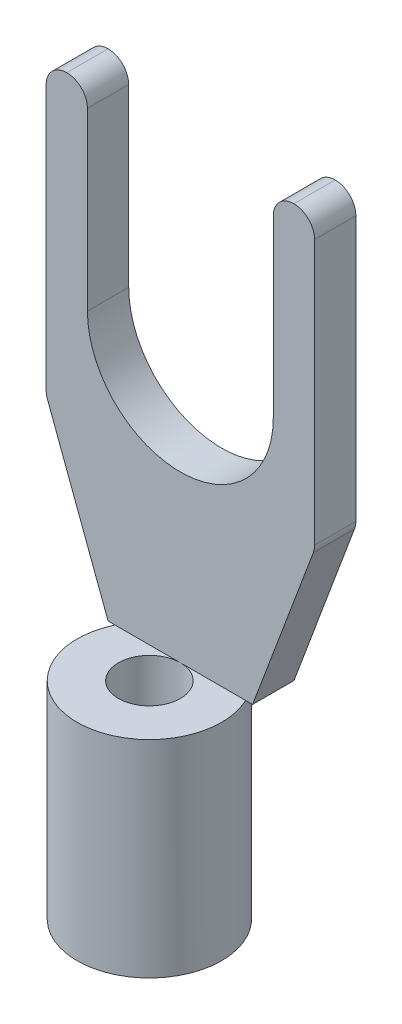
ISO-10303-21;
HEADER;
FILE_DESCRIPTION(('STEP AP214'),'2;1');
FILE_NAME('part.step','',(''),(''),'','','');
FILE_SCHEMA(('AUTOMOTIVE_DESIGN { 1 0 10303 214 1 1 1 1 }'));
ENDSEC;
DATA;
#1=APPLICATION_CONTEXT('core data for automotive mechanical design processes');
#2=APPLICATION_PROTOCOL_DEFINITION('international standard','automotive_design',2000,#1);
#3=PRODUCT_CONTEXT('',#1,'mechanical');
#4=PRODUCT('Part','Part','',(#3));
#5=PRODUCT_RELATED_PRODUCT_CATEGORY('part','',(#4));
#6=PRODUCT_DEFINITION_FORMATION('','',#4);
#7=PRODUCT_DEFINITION_CONTEXT('part definition',#1,'design');
#8=PRODUCT_DEFINITION('design','',#6,#7);
#9=PRODUCT_DEFINITION_SHAPE('','',#8);
#10=(LENGTH_UNIT() NAMED_UNIT(*) SI_UNIT(.MILLI.,.METRE.));
#11=(NAMED_UNIT(*) PLANE_ANGLE_UNIT() SI_UNIT($,.RADIAN.));
#12=(NAMED_UNIT(*) SI_UNIT($,.STERADIAN.) SOLID_ANGLE_UNIT());
#13=UNCERTAINTY_MEASURE_WITH_UNIT(LENGTH_MEASURE(1.E-05),#10,'distance_accuracy_value','');
#14=(GEOMETRIC_REPRESENTATION_CONTEXT(3) GLOBAL_UNCERTAINTY_ASSIGNED_CONTEXT((#13)) GLOBAL_UNIT_ASSIGNED_CONTEXT((#10,
#11,#12)) REPRESENTATION_CONTEXT('',''));
#15=CARTESIAN_POINT('',(0.,0.,0.));
#16=DIRECTION('',(0.,0.,1.));
#17=DIRECTION('',(1.,0.,0.));
#18=AXIS2_PLACEMENT_3D('',#15,#16,#17);
#19=CARTESIAN_POINT('',(-1.75,-2.,1.));
#20=DIRECTION('',(0.,1.,0.));
#21=DIRECTION('',(-1.,0.,0.));
#22=AXIS2_PLACEMENT_3D('',#19,#20,#21);
#23=PLANE('',#22);
#24=CARTESIAN_POINT('',(0.,-2.,1.75));
#25=DIRECTION('',(0.,-1.,0.));
#26=DIRECTION('',(1.,0.,0.));
#27=AXIS2_PLACEMENT_3D('',#24,#25,#26);
#28=CIRCLE('',#27,1.75);
#29=CARTESIAN_POINT('',(-1.58113883008419,-2.,1.));
#30=VERTEX_POINT('',#29);
#31=CARTESIAN_POINT('',(0.,-2.,0.));
#32=VERTEX_POINT('',#31);
#33=EDGE_CURVE('E44',#30,#32,#28,.T.);
#34=ORIENTED_EDGE('',*,*,#33,.F.);
#35=DIRECTION('',(1.,0.,0.));
#36=VECTOR('',#35,1.);
#37=CARTESIAN_POINT('',(-1.75,-2.,1.));
#38=LINE('',#37,#36);
#39=CARTESIAN_POINT('',(-1.75,-2.,1.));
#40=VERTEX_POINT('',#39);
#41=EDGE_CURVE('E166',#40,#30,#38,.T.);
#42=ORIENTED_EDGE('',*,*,#41,.F.);
#43=DIRECTION('',(0.,0.,-1.));
#44=VECTOR('',#43,1.);
#45=CARTESIAN_POINT('',(-1.75,-2.,1.));
#46=LINE('',#45,#44);
#47=CARTESIAN_POINT('',(-1.75,-2.,0.));
#48=VERTEX_POINT('',#47);
#49=EDGE_CURVE('E221',#40,#48,#46,.T.);
#50=ORIENTED_EDGE('',*,*,#49,.T.);
#51=DIRECTION('',(1.,0.,0.));
#52=VECTOR('',#51,1.);
#53=CARTESIAN_POINT('',(-1.75,-2.,0.));
#54=LINE('',#53,#52);
#55=EDGE_CURVE('E198',#48,#32,#54,.T.);
#56=ORIENTED_EDGE('',*,*,#55,.T.);
#57=EDGE_LOOP('',(#34,#42,#50,#56));
#58=FACE_BOUND('',#57,.T.);
#59=ADVANCED_FACE('F33',(#58),#23,.F.);
#60=CARTESIAN_POINT('',(-3.25,2.,1.));
#61=DIRECTION('',(0.936329177569045,0.351123441588391,0.));
#62=DIRECTION('',(-0.351123441588392,0.936329177569045,0.));
#63=AXIS2_PLACEMENT_3D('',#60,#61,#62);
#64=PLANE('',#63);
#65=DIRECTION('',(0.351123441588392,-0.936329177569045,0.));
#66=VECTOR('',#65,1.);
#67=CARTESIAN_POINT('',(-3.25,2.,1.));
#68=LINE('',#67,#66);
#69=CARTESIAN_POINT('',(-3.21816458878452,1.91510557009206,1.));
#70=VERTEX_POINT('',#69);
#71=EDGE_CURVE('E165',#70,#40,#68,.T.);
#72=ORIENTED_EDGE('',*,*,#71,.F.);
#73=DIRECTION('',(0.,0.,-1.));
#74=VECTOR('',#73,1.);
#75=CARTESIAN_POINT('',(-3.21816458878452,1.91510557009206,1.));
#76=LINE('',#75,#74);
#77=CARTESIAN_POINT('',(-3.21816458878452,1.91510557009206,0.));
#78=VERTEX_POINT('',#77);
#79=EDGE_CURVE('E224',#70,#78,#76,.T.);
#80=ORIENTED_EDGE('',*,*,#79,.T.);
#81=DIRECTION('',(0.351123441588392,-0.936329177569045,0.));
#82=VECTOR('',#81,1.);
#83=CARTESIAN_POINT('',(-3.25,2.,0.));
#84=LINE('',#83,#82);
#85=EDGE_CURVE('E194',#78,#48,#84,.T.);
#86=ORIENTED_EDGE('',*,*,#85,.T.);
#87=ORIENTED_EDGE('',*,*,#49,.F.);
#88=EDGE_LOOP('',(#72,#80,#86,#87));
#89=FACE_BOUND('',#88,.T.);
#90=ADVANCED_FACE('F292',(#89),#64,.F.);
#91=CARTESIAN_POINT('',(1.58113883008419,-2.,1.));
#92=VERTEX_POINT('',#91);
#93=EDGE_CURVE('E11',#32,#92,#28,.T.);
#94=ORIENTED_EDGE('',*,*,#93,.F.);
#95=CARTESIAN_POINT('',(1.75,-2.,0.));
#96=VERTEX_POINT('',#95);
#97=EDGE_CURVE('E196',#32,#96,#54,.T.);
#98=ORIENTED_EDGE('',*,*,#97,.T.);
#99=DIRECTION('',(0.,0.,-1.));
#100=VECTOR('',#99,1.);
#101=CARTESIAN_POINT('',(1.75,-2.,1.));
#102=LINE('',#101,#100);
#103=CARTESIAN_POINT('',(1.75,-2.,1.));
#104=VERTEX_POINT('',#103);
#105=EDGE_CURVE('E163',#104,#96,#102,.T.);
#106=ORIENTED_EDGE('',*,*,#105,.F.);
#107=EDGE_CURVE('E153',#92,#104,#38,.T.);
#108=ORIENTED_EDGE('',*,*,#107,.F.);
#109=EDGE_LOOP('',(#94,#98,#106,#108));
#110=FACE_BOUND('',#109,.T.);
#111=ADVANCED_FACE('F160',(#110),#23,.F.);
#112=CARTESIAN_POINT('',(1.75,-2.,1.));
#113=DIRECTION('',(-0.936329177569044,0.351123441588392,0.));
#114=DIRECTION('',(-0.351123441588392,-0.936329177569045,0.));
#115=AXIS2_PLACEMENT_3D('',#112,#113,#114);
#116=PLANE('',#115);
#117=DIRECTION('',(0.351123441588392,0.936329177569045,0.));
#118=VECTOR('',#117,1.);
#119=CARTESIAN_POINT('',(1.75,-2.,0.));
#120=LINE('',#119,#118);
#121=CARTESIAN_POINT('',(3.21816458878452,1.91510557009206,0.));
#122=VERTEX_POINT('',#121);
#123=EDGE_CURVE('E200',#96,#122,#120,.T.);
#124=ORIENTED_EDGE('',*,*,#123,.T.);
#125=DIRECTION('',(0.,0.,-1.));
#126=VECTOR('',#125,1.);
#127=CARTESIAN_POINT('',(3.21816458878452,1.91510557009206,1.));
#128=LINE('',#127,#126);
#129=CARTESIAN_POINT('',(3.21816458878452,1.91510557009206,1.));
#130=VERTEX_POINT('',#129);
#131=EDGE_CURVE('E261',#122,#130,#128,.F.);
#132=ORIENTED_EDGE('',*,*,#131,.T.);
#133=DIRECTION('',(0.351123441588392,0.936329177569045,0.));
#134=VECTOR('',#133,1.);
#135=CARTESIAN_POINT('',(1.75,-2.,1.));
#136=LINE('',#135,#134);
#137=EDGE_CURVE('E179',#104,#130,#136,.T.);
#138=ORIENTED_EDGE('',*,*,#137,.F.);
#139=ORIENTED_EDGE('',*,*,#105,.T.);
#140=EDGE_LOOP('',(#124,#132,#138,#139));
#141=FACE_BOUND('',#140,.T.);
#142=ADVANCED_FACE('F299',(#141),#116,.F.);
#143=CARTESIAN_POINT('',(3.25,2.,1.));
#144=DIRECTION('',(-1.,0.,0.));
#145=DIRECTION('',(0.,-1.,0.));
#146=AXIS2_PLACEMENT_3D('',#143,#144,#145);
#147=PLANE('',#146);
#148=DIRECTION('',(0.,1.,0.));
#149=VECTOR('',#148,1.);
#150=CARTESIAN_POINT('',(3.25,2.,1.));
#151=LINE('',#150,#149);
#152=CARTESIAN_POINT('',(3.25,2.09066729088625,1.));
#153=VERTEX_POINT('',#152);
#154=CARTESIAN_POINT('',(3.25,8.5,1.));
#155=VERTEX_POINT('',#154);
#156=EDGE_CURVE('E181',#153,#155,#151,.T.);
#157=ORIENTED_EDGE('',*,*,#156,.F.);
#158=DIRECTION('',(0.,0.,-1.));
#159=VECTOR('',#158,1.);
#160=CARTESIAN_POINT('',(3.25,2.09066729088625,1.));
#161=LINE('',#160,#159);
#162=CARTESIAN_POINT('',(3.25,2.09066729088625,0.));
#163=VERTEX_POINT('',#162);
#164=EDGE_CURVE('E258',#153,#163,#161,.T.);
#165=ORIENTED_EDGE('',*,*,#164,.T.);
#166=DIRECTION('',(0.,1.,0.));
#167=VECTOR('',#166,1.);
#168=CARTESIAN_POINT('',(3.25,2.,0.));
#169=LINE('',#168,#167);
#170=CARTESIAN_POINT('',(3.25,8.5,0.));
#171=VERTEX_POINT('',#170);
#172=EDGE_CURVE('E203',#163,#171,#169,.T.);
#173=ORIENTED_EDGE('',*,*,#172,.T.);
#174=DIRECTION('',(0.,0.,-1.));
#175=VECTOR('',#174,1.);
#176=CARTESIAN_POINT('',(3.25,8.5,1.));
#177=LINE('',#176,#175);
#178=EDGE_CURVE('E255',#171,#155,#177,.F.);
#179=ORIENTED_EDGE('',*,*,#178,.T.);
#180=EDGE_LOOP('',(#157,#165,#173,#179));
#181=FACE_BOUND('',#180,.T.);
#182=ADVANCED_FACE('F308',(#181),#147,.F.);
#183=CARTESIAN_POINT('',(2.25,4.25,1.));
#184=DIRECTION('',(1.,0.,0.));
#185=DIRECTION('',(0.,0.,-1.));
#186=AXIS2_PLACEMENT_3D('',#183,#184,#185);
#187=PLANE('',#186);
#188=DIRECTION('',(0.,-1.,0.));
#189=VECTOR('',#188,1.);
#190=CARTESIAN_POINT('',(2.25,4.25,1.));
#191=LINE('',#190,#189);
#192=CARTESIAN_POINT('',(2.25,8.5,1.));
#193=VERTEX_POINT('',#192);
#194=CARTESIAN_POINT('',(2.25,4.25,1.));
#195=VERTEX_POINT('',#194);
#196=EDGE_CURVE('E184',#193,#195,#191,.T.);
#197=ORIENTED_EDGE('',*,*,#196,.F.);
#198=DIRECTION('',(0.,0.,-1.));
#199=VECTOR('',#198,1.);
#200=CARTESIAN_POINT('',(2.25,8.5,1.));
#201=LINE('',#200,#199);
#202=CARTESIAN_POINT('',(2.25,8.5,0.));
#203=VERTEX_POINT('',#202);
#204=EDGE_CURVE('E263',#193,#203,#201,.T.);
#205=ORIENTED_EDGE('',*,*,#204,.T.);
#206=DIRECTION('',(0.,-1.,0.));
#207=VECTOR('',#206,1.);
#208=CARTESIAN_POINT('',(2.25,4.25,0.));
#209=LINE('',#208,#207);
#210=CARTESIAN_POINT('',(2.25,4.25,0.));
#211=VERTEX_POINT('',#210);
#212=EDGE_CURVE('E206',#203,#211,#209,.T.);
#213=ORIENTED_EDGE('',*,*,#212,.T.);
#214=DIRECTION('',(0.,0.,-1.));
#215=VECTOR('',#214,1.);
#216=CARTESIAN_POINT('',(2.25,4.25,1.));
#217=LINE('',#216,#215);
#218=EDGE_CURVE('E217',#195,#211,#217,.T.);
#219=ORIENTED_EDGE('',*,*,#218,.F.);
#220=EDGE_LOOP('',(#197,#205,#213,#219));
#221=FACE_BOUND('',#220,.T.);
#222=ADVANCED_FACE('F319',(#221),#187,.F.);
#223=CARTESIAN_POINT('',(0.,4.25,1.));
#224=DIRECTION('',(0.,0.,-1.));
#225=DIRECTION('',(-1.,0.,0.));
#226=AXIS2_PLACEMENT_3D('',#223,#224,#225);
#227=CYLINDRICAL_SURFACE('',#226,2.25);
#228=CARTESIAN_POINT('',(0.,4.25,0.));
#229=DIRECTION('',(0.,0.,-1.));
#230=DIRECTION('',(1.,0.,0.));
#231=AXIS2_PLACEMENT_3D('',#228,#229,#230);
#232=CIRCLE('',#231,2.25);
#233=CARTESIAN_POINT('',(-2.25,4.25,0.));
#234=VERTEX_POINT('',#233);
#235=EDGE_CURVE('E208',#211,#234,#232,.T.);
#236=ORIENTED_EDGE('',*,*,#235,.T.);
#237=DIRECTION('',(0.,0.,-1.));
#238=VECTOR('',#237,1.);
#239=CARTESIAN_POINT('',(-2.25,4.25,1.));
#240=LINE('',#239,#238);
#241=CARTESIAN_POINT('',(-2.25,4.25,1.));
#242=VERTEX_POINT('',#241);
#243=EDGE_CURVE('E193',#242,#234,#240,.T.);
#244=ORIENTED_EDGE('',*,*,#243,.F.);
#245=CARTESIAN_POINT('',(0.,4.25,1.));
#246=DIRECTION('',(0.,0.,-1.));
#247=DIRECTION('',(1.,0.,0.));
#248=AXIS2_PLACEMENT_3D('',#245,#246,#247);
#249=CIRCLE('',#248,2.25);
#250=EDGE_CURVE('E186',#195,#242,#249,.T.);
#251=ORIENTED_EDGE('',*,*,#250,.F.);
#252=ORIENTED_EDGE('',*,*,#218,.T.);
#253=EDGE_LOOP('',(#236,#244,#251,#252));
#254=FACE_BOUND('',#253,.T.);
#255=ADVANCED_FACE('F325',(#254),#227,.F.);
#256=CARTESIAN_POINT('',(-2.25,9.,1.));
#257=DIRECTION('',(-1.,0.,0.));
#258=DIRECTION('',(0.,0.,1.));
#259=AXIS2_PLACEMENT_3D('',#256,#257,#258);
#260=PLANE('',#259);
#261=DIRECTION('',(0.,1.,0.));
#262=VECTOR('',#261,1.);
#263=CARTESIAN_POINT('',(-2.25,9.,0.));
#264=LINE('',#263,#262);
#265=CARTESIAN_POINT('',(-2.25,8.5,0.));
#266=VERTEX_POINT('',#265);
#267=EDGE_CURVE('E210',#234,#266,#264,.T.);
#268=ORIENTED_EDGE('',*,*,#267,.T.);
#269=DIRECTION('',(0.,0.,-1.));
#270=VECTOR('',#269,1.);
#271=CARTESIAN_POINT('',(-2.25,8.5,1.));
#272=LINE('',#271,#270);
#273=CARTESIAN_POINT('',(-2.25,8.5,1.));
#274=VERTEX_POINT('',#273);
#275=EDGE_CURVE('E42',#266,#274,#272,.F.);
#276=ORIENTED_EDGE('',*,*,#275,.T.);
#277=DIRECTION('',(0.,1.,0.));
#278=VECTOR('',#277,1.);
#279=CARTESIAN_POINT('',(-2.25,9.,1.));
#280=LINE('',#279,#278);
#281=EDGE_CURVE('E188',#242,#274,#280,.T.);
#282=ORIENTED_EDGE('',*,*,#281,.F.);
#283=ORIENTED_EDGE('',*,*,#243,.T.);
#284=EDGE_LOOP('',(#268,#276,#282,#283));
#285=FACE_BOUND('',#284,.T.);
#286=ADVANCED_FACE('F329',(#285),#260,.F.);
#287=CARTESIAN_POINT('',(-3.25,9.,1.));
#288=DIRECTION('',(1.,0.,0.));
#289=DIRECTION('',(0.,1.,0.));
#290=AXIS2_PLACEMENT_3D('',#287,#288,#289);
#291=PLANE('',#290);
#292=DIRECTION('',(0.,-1.,0.));
#293=VECTOR('',#292,1.);
#294=CARTESIAN_POINT('',(-3.25,9.,0.));
#295=LINE('',#294,#293);
#296=CARTESIAN_POINT('',(-3.25,8.5,0.));
#297=VERTEX_POINT('',#296);
#298=CARTESIAN_POINT('',(-3.25,2.09066729088626,0.));
#299=VERTEX_POINT('',#298);
#300=EDGE_CURVE('E177',#297,#299,#295,.T.);
#301=ORIENTED_EDGE('',*,*,#300,.T.);
#302=DIRECTION('',(0.,0.,-1.));
#303=VECTOR('',#302,1.);
#304=CARTESIAN_POINT('',(-3.25,2.09066729088626,1.));
#305=LINE('',#304,#303);
#306=CARTESIAN_POINT('',(-3.25,2.09066729088626,1.));
#307=VERTEX_POINT('',#306);
#308=EDGE_CURVE('E241',#299,#307,#305,.F.);
#309=ORIENTED_EDGE('',*,*,#308,.T.);
#310=DIRECTION('',(0.,-1.,0.));
#311=VECTOR('',#310,1.);
#312=CARTESIAN_POINT('',(-3.25,9.,1.));
#313=LINE('',#312,#311);
#314=CARTESIAN_POINT('',(-3.25,8.5,1.));
#315=VERTEX_POINT('',#314);
#316=EDGE_CURVE('E191',#315,#307,#313,.T.);
#317=ORIENTED_EDGE('',*,*,#316,.F.);
#318=DIRECTION('',(0.,0.,-1.));
#319=VECTOR('',#318,1.);
#320=CARTESIAN_POINT('',(-3.25,8.5,1.));
#321=LINE('',#320,#319);
#322=EDGE_CURVE('E239',#315,#297,#321,.T.);
#323=ORIENTED_EDGE('',*,*,#322,.T.);
#324=EDGE_LOOP('',(#301,#309,#317,#323));
#325=FACE_BOUND('',#324,.T.);
#326=ADVANCED_FACE('F283',(#325),#291,.F.);
#327=CARTESIAN_POINT('',(0.,4.25,1.));
#328=DIRECTION('',(0.,0.,1.));
#329=DIRECTION('',(1.,0.,0.));
#330=AXIS2_PLACEMENT_3D('',#327,#328,#329);
#331=PLANE('',#330);
#332=ORIENTED_EDGE('',*,*,#316,.T.);
#333=CARTESIAN_POINT('',(-2.75,2.09066729088625,1.));
#334=DIRECTION('',(0.,0.,1.));
#335=DIRECTION('',(1.,0.,0.));
#336=AXIS2_PLACEMENT_3D('',#333,#334,#335);
#337=CIRCLE('',#336,0.5);
#338=EDGE_CURVE('E253',#307,#70,#337,.T.);
#339=ORIENTED_EDGE('',*,*,#338,.T.);
#340=ORIENTED_EDGE('',*,*,#71,.T.);
#341=ORIENTED_EDGE('',*,*,#41,.T.);
#342=CARTESIAN_POINT('',(0.,-2.,1.));
#343=VERTEX_POINT('',#342);
#344=EDGE_CURVE('E52',#30,#343,#38,.T.);
#345=ORIENTED_EDGE('',*,*,#344,.T.);
#346=EDGE_CURVE('E148',#343,#92,#38,.T.);
#347=ORIENTED_EDGE('',*,*,#346,.T.);
#348=ORIENTED_EDGE('',*,*,#107,.T.);
#349=ORIENTED_EDGE('',*,*,#137,.T.);
#350=CARTESIAN_POINT('',(2.75,2.09066729088625,1.));
#351=DIRECTION('',(0.,0.,1.));
#352=DIRECTION('',(1.,0.,0.));
#353=AXIS2_PLACEMENT_3D('',#350,#351,#352);
#354=CIRCLE('',#353,0.5);
#355=EDGE_CURVE('E251',#130,#153,#354,.T.);
#356=ORIENTED_EDGE('',*,*,#355,.T.);
#357=ORIENTED_EDGE('',*,*,#156,.T.);
#358=CARTESIAN_POINT('',(2.75,8.5,1.));
#359=DIRECTION('',(0.,0.,1.));
#360=DIRECTION('',(1.,0.,0.));
#361=AXIS2_PLACEMENT_3D('',#358,#359,#360);
#362=CIRCLE('',#361,0.5);
#363=CARTESIAN_POINT('',(2.75,9.,1.));
#364=VERTEX_POINT('',#363);
#365=EDGE_CURVE('E249',#155,#364,#362,.T.);
#366=ORIENTED_EDGE('',*,*,#365,.T.);
#367=CARTESIAN_POINT('',(2.75,8.5,1.));
#368=DIRECTION('',(0.,0.,1.));
#369=DIRECTION('',(1.,0.,0.));
#370=AXIS2_PLACEMENT_3D('',#367,#368,#369);
#371=CIRCLE('',#370,0.5);
#372=EDGE_CURVE('E247',#364,#193,#371,.T.);
#373=ORIENTED_EDGE('',*,*,#372,.T.);
#374=ORIENTED_EDGE('',*,*,#196,.T.);
#375=ORIENTED_EDGE('',*,*,#250,.T.);
#376=ORIENTED_EDGE('',*,*,#281,.T.);
#377=CARTESIAN_POINT('',(-2.75,8.5,1.));
#378=DIRECTION('',(0.,0.,1.));
#379=DIRECTION('',(1.,0.,0.));
#380=AXIS2_PLACEMENT_3D('',#377,#378,#379);
#381=CIRCLE('',#380,0.5);
#382=CARTESIAN_POINT('',(-2.75,9.,1.));
#383=VERTEX_POINT('',#382);
#384=EDGE_CURVE('E245',#274,#383,#381,.T.);
#385=ORIENTED_EDGE('',*,*,#384,.T.);
#386=CARTESIAN_POINT('',(-2.75,8.5,1.));
#387=DIRECTION('',(0.,0.,1.));
#388=DIRECTION('',(1.,0.,0.));
#389=AXIS2_PLACEMENT_3D('',#386,#387,#388);
#390=CIRCLE('',#389,0.5);
#391=EDGE_CURVE('E243',#383,#315,#390,.T.);
#392=ORIENTED_EDGE('',*,*,#391,.T.);
#393=EDGE_LOOP('',(#332,#339,#340,#341,#345,#347,#348,#349,#356,#357,#366,#373,#374,#375,#376,
#385,#392));
#394=FACE_BOUND('',#393,.T.);
#395=ADVANCED_FACE('F151',(#394),#331,.T.);
#396=CARTESIAN_POINT('',(0.,4.25,0.));
#397=DIRECTION('',(0.,0.,1.));
#398=DIRECTION('',(1.,0.,0.));
#399=AXIS2_PLACEMENT_3D('',#396,#397,#398);
#400=PLANE('',#399);
#401=ORIENTED_EDGE('',*,*,#85,.F.);
#402=CARTESIAN_POINT('',(-2.75,2.09066729088625,0.));
#403=DIRECTION('',(0.,0.,1.));
#404=DIRECTION('',(1.,0.,0.));
#405=AXIS2_PLACEMENT_3D('',#402,#403,#404);
#406=CIRCLE('',#405,0.5);
#407=EDGE_CURVE('E237',#78,#299,#406,.F.);
#408=ORIENTED_EDGE('',*,*,#407,.T.);
#409=ORIENTED_EDGE('',*,*,#300,.F.);
#410=CARTESIAN_POINT('',(-2.75,8.5,0.));
#411=DIRECTION('',(0.,0.,1.));
#412=DIRECTION('',(1.,0.,0.));
#413=AXIS2_PLACEMENT_3D('',#410,#411,#412);
#414=CIRCLE('',#413,0.5);
#415=CARTESIAN_POINT('',(-2.75,9.,0.));
#416=VERTEX_POINT('',#415);
#417=EDGE_CURVE('E227',#297,#416,#414,.F.);
#418=ORIENTED_EDGE('',*,*,#417,.T.);
#419=CARTESIAN_POINT('',(-2.75,8.5,0.));
#420=DIRECTION('',(0.,0.,1.));
#421=DIRECTION('',(1.,0.,0.));
#422=AXIS2_PLACEMENT_3D('',#419,#420,#421);
#423=CIRCLE('',#422,0.5);
#424=EDGE_CURVE('E229',#416,#266,#423,.F.);
#425=ORIENTED_EDGE('',*,*,#424,.T.);
#426=ORIENTED_EDGE('',*,*,#267,.F.);
#427=ORIENTED_EDGE('',*,*,#235,.F.);
#428=ORIENTED_EDGE('',*,*,#212,.F.);
#429=CARTESIAN_POINT('',(2.75,8.5,0.));
#430=DIRECTION('',(0.,0.,1.));
#431=DIRECTION('',(1.,0.,0.));
#432=AXIS2_PLACEMENT_3D('',#429,#430,#431);
#433=CIRCLE('',#432,0.5);
#434=CARTESIAN_POINT('',(2.75,9.,0.));
#435=VERTEX_POINT('',#434);
#436=EDGE_CURVE('E231',#203,#435,#433,.F.);
#437=ORIENTED_EDGE('',*,*,#436,.T.);
#438=CARTESIAN_POINT('',(2.75,8.5,0.));
#439=DIRECTION('',(0.,0.,1.));
#440=DIRECTION('',(1.,0.,0.));
#441=AXIS2_PLACEMENT_3D('',#438,#439,#440);
#442=CIRCLE('',#441,0.5);
#443=EDGE_CURVE('E233',#435,#171,#442,.F.);
#444=ORIENTED_EDGE('',*,*,#443,.T.);
#445=ORIENTED_EDGE('',*,*,#172,.F.);
#446=CARTESIAN_POINT('',(2.75,2.09066729088625,0.));
#447=DIRECTION('',(0.,0.,1.));
#448=DIRECTION('',(1.,0.,0.));
#449=AXIS2_PLACEMENT_3D('',#446,#447,#448);
#450=CIRCLE('',#449,0.5);
#451=EDGE_CURVE('E235',#163,#122,#450,.F.);
#452=ORIENTED_EDGE('',*,*,#451,.T.);
#453=ORIENTED_EDGE('',*,*,#123,.F.);
#454=ORIENTED_EDGE('',*,*,#97,.F.);
#455=ORIENTED_EDGE('',*,*,#55,.F.);
#456=EDGE_LOOP('',(#401,#408,#409,#418,#425,#426,#427,#428,#437,#444,#445,#452,#453,#454,#455));
#457=FACE_BOUND('',#456,.T.);
#458=ADVANCED_FACE('F296',(#457),#400,.F.);
#459=CARTESIAN_POINT('',(-2.75,2.09066729088625,1.));
#460=DIRECTION('',(0.,0.,-1.));
#461=DIRECTION('',(-1.,0.,0.));
#462=AXIS2_PLACEMENT_3D('',#459,#460,#461);
#463=CYLINDRICAL_SURFACE('',#462,0.5);
#464=ORIENTED_EDGE('',*,*,#338,.F.);
#465=ORIENTED_EDGE('',*,*,#308,.F.);
#466=ORIENTED_EDGE('',*,*,#407,.F.);
#467=ORIENTED_EDGE('',*,*,#79,.F.);
#468=EDGE_LOOP('',(#464,#465,#466,#467));
#469=FACE_BOUND('',#468,.T.);
#470=ADVANCED_FACE('F287',(#469),#463,.T.);
#471=CARTESIAN_POINT('',(2.75,2.09066729088625,1.));
#472=DIRECTION('',(0.,0.,-1.));
#473=DIRECTION('',(-1.,0.,0.));
#474=AXIS2_PLACEMENT_3D('',#471,#472,#473);
#475=CYLINDRICAL_SURFACE('',#474,0.5);
#476=ORIENTED_EDGE('',*,*,#355,.F.);
#477=ORIENTED_EDGE('',*,*,#131,.F.);
#478=ORIENTED_EDGE('',*,*,#451,.F.);
#479=ORIENTED_EDGE('',*,*,#164,.F.);
#480=EDGE_LOOP('',(#476,#477,#478,#479));
#481=FACE_BOUND('',#480,.T.);
#482=ADVANCED_FACE('F305',(#481),#475,.T.);
#483=CARTESIAN_POINT('',(2.75,8.5,1.));
#484=DIRECTION('',(0.,0.,-1.));
#485=DIRECTION('',(-1.,0.,0.));
#486=AXIS2_PLACEMENT_3D('',#483,#484,#485);
#487=CYLINDRICAL_SURFACE('',#486,0.5);
#488=ORIENTED_EDGE('',*,*,#204,.F.);
#489=ORIENTED_EDGE('',*,*,#372,.F.);
#490=DIRECTION('',(0.,0.,-1.));
#491=VECTOR('',#490,1.);
#492=CARTESIAN_POINT('',(2.75,9.,1.));
#493=LINE('',#492,#491);
#494=EDGE_CURVE('E197',#435,#364,#493,.F.);
#495=ORIENTED_EDGE('',*,*,#494,.F.);
#496=ORIENTED_EDGE('',*,*,#436,.F.);
#497=EDGE_LOOP('',(#488,#489,#495,#496));
#498=FACE_BOUND('',#497,.T.);
#499=ADVANCED_FACE('F317',(#498),#487,.T.);
#500=CARTESIAN_POINT('',(2.75,8.5,1.));
#501=DIRECTION('',(0.,0.,-1.));
#502=DIRECTION('',(-1.,0.,0.));
#503=AXIS2_PLACEMENT_3D('',#500,#501,#502);
#504=CYLINDRICAL_SURFACE('',#503,0.5);
#505=ORIENTED_EDGE('',*,*,#365,.F.);
#506=ORIENTED_EDGE('',*,*,#178,.F.);
#507=ORIENTED_EDGE('',*,*,#443,.F.);
#508=ORIENTED_EDGE('',*,*,#494,.T.);
#509=EDGE_LOOP('',(#505,#506,#507,#508));
#510=FACE_BOUND('',#509,.T.);
#511=ADVANCED_FACE('F312',(#510),#504,.T.);
#512=CARTESIAN_POINT('',(-2.75,8.5,1.));
#513=DIRECTION('',(0.,0.,-1.));
#514=DIRECTION('',(-1.,0.,0.));
#515=AXIS2_PLACEMENT_3D('',#512,#513,#514);
#516=CYLINDRICAL_SURFACE('',#515,0.5);
#517=ORIENTED_EDGE('',*,*,#322,.F.);
#518=ORIENTED_EDGE('',*,*,#391,.F.);
#519=DIRECTION('',(0.,0.,-1.));
#520=VECTOR('',#519,1.);
#521=CARTESIAN_POINT('',(-2.75,9.,1.));
#522=LINE('',#521,#520);
#523=EDGE_CURVE('E37',#416,#383,#522,.F.);
#524=ORIENTED_EDGE('',*,*,#523,.F.);
#525=ORIENTED_EDGE('',*,*,#417,.F.);
#526=EDGE_LOOP('',(#517,#518,#524,#525));
#527=FACE_BOUND('',#526,.T.);
#528=ADVANCED_FACE('F35',(#527),#516,.T.);
#529=CARTESIAN_POINT('',(-2.75,8.5,1.));
#530=DIRECTION('',(0.,0.,-1.));
#531=DIRECTION('',(-1.,0.,0.));
#532=AXIS2_PLACEMENT_3D('',#529,#530,#531);
#533=CYLINDRICAL_SURFACE('',#532,0.5);
#534=ORIENTED_EDGE('',*,*,#384,.F.);
#535=ORIENTED_EDGE('',*,*,#275,.F.);
#536=ORIENTED_EDGE('',*,*,#424,.F.);
#537=ORIENTED_EDGE('',*,*,#523,.T.);
#538=EDGE_LOOP('',(#534,#535,#536,#537));
#539=FACE_BOUND('',#538,.T.);
#540=ADVANCED_FACE('F274',(#539),#533,.T.);
#541=CARTESIAN_POINT('',(0.,-2.,1.75));
#542=DIRECTION('',(0.,-1.,0.));
#543=DIRECTION('',(1.,0.,0.));
#544=AXIS2_PLACEMENT_3D('',#541,#542,#543);
#545=PLANE('',#544);
#546=ORIENTED_EDGE('',*,*,#344,.F.);
#547=EDGE_CURVE('E45',#92,#30,#28,.T.);
#548=ORIENTED_EDGE('',*,*,#547,.F.);
#549=ORIENTED_EDGE('',*,*,#346,.F.);
#550=CARTESIAN_POINT('',(0.,-2.,1.75));
#551=DIRECTION('',(0.,-1.,0.));
#552=DIRECTION('',(1.,0.,0.));
#553=AXIS2_PLACEMENT_3D('',#550,#551,#552);
#554=CIRCLE('',#553,0.75);
#555=EDGE_CURVE('E452',#343,#343,#554,.T.);
#556=ORIENTED_EDGE('',*,*,#555,.T.);
#557=EDGE_LOOP('',(#546,#548,#549,#556));
#558=FACE_BOUND('',#557,.T.);
#559=ADVANCED_FACE('F168',(#558),#545,.F.);
#560=CARTESIAN_POINT('',(0.,-7.,1.75));
#561=DIRECTION('',(0.,-1.,0.));
#562=DIRECTION('',(1.,0.,0.));
#563=AXIS2_PLACEMENT_3D('',#560,#561,#562);
#564=PLANE('',#563);
#565=CARTESIAN_POINT('',(0.,-7.,1.75));
#566=DIRECTION('',(0.,-1.,0.));
#567=DIRECTION('',(1.,0.,0.));
#568=AXIS2_PLACEMENT_3D('',#565,#566,#567);
#569=CIRCLE('',#568,1.75);
#570=CARTESIAN_POINT('',(1.75,-7.,1.75));
#571=VERTEX_POINT('',#570);
#572=EDGE_CURVE('E172',#571,#571,#569,.T.);
#573=ORIENTED_EDGE('',*,*,#572,.T.);
#574=EDGE_LOOP('',(#573));
#575=FACE_BOUND('',#574,.T.);
#576=CARTESIAN_POINT('',(0.,-7.,1.75));
#577=DIRECTION('',(0.,-1.,0.));
#578=DIRECTION('',(1.,0.,0.));
#579=AXIS2_PLACEMENT_3D('',#576,#577,#578);
#580=CIRCLE('',#579,0.75);
#581=CARTESIAN_POINT('',(0.750000000000001,-7.,1.75));
#582=VERTEX_POINT('',#581);
#583=EDGE_CURVE('E170',#582,#582,#580,.T.);
#584=ORIENTED_EDGE('',*,*,#583,.F.);
#585=EDGE_LOOP('',(#584));
#586=FACE_BOUND('',#585,.T.);
#587=ADVANCED_FACE('F415',(#575,#586),#564,.T.);
#588=CARTESIAN_POINT('',(0.,-7.,1.75));
#589=DIRECTION('',(0.,1.,0.));
#590=DIRECTION('',(-1.,0.,0.));
#591=AXIS2_PLACEMENT_3D('',#588,#589,#590);
#592=CYLINDRICAL_SURFACE('',#591,1.75);
#593=ORIENTED_EDGE('',*,*,#572,.F.);
#594=EDGE_LOOP('',(#593));
#595=FACE_BOUND('',#594,.T.);
#596=ORIENTED_EDGE('',*,*,#33,.T.);
#597=ORIENTED_EDGE('',*,*,#93,.T.);
#598=ORIENTED_EDGE('',*,*,#547,.T.);
#599=EDGE_LOOP('',(#596,#597,#598));
#600=FACE_BOUND('',#599,.T.);
#601=ADVANCED_FACE('F171',(#595,#600),#592,.T.);
#602=CARTESIAN_POINT('',(0.,-7.,1.75));
#603=DIRECTION('',(0.,1.,0.));
#604=DIRECTION('',(-1.,0.,0.));
#605=AXIS2_PLACEMENT_3D('',#602,#603,#604);
#606=CYLINDRICAL_SURFACE('',#605,0.75);
#607=ORIENTED_EDGE('',*,*,#583,.T.);
#608=EDGE_LOOP('',(#607));
#609=FACE_BOUND('',#608,.T.);
#610=ORIENTED_EDGE('',*,*,#555,.F.);
#611=EDGE_LOOP('',(#610));
#612=FACE_BOUND('',#611,.T.);
#613=ADVANCED_FACE('F434',(#609,#612),#606,.F.);
#614=CLOSED_SHELL('',(#59,#90,#111,#142,#182,#222,#255,#286,#326,#395,#458,#470,#482,#499,#511,
#528,#540,#559,#587,#601,#613));
#615=MANIFOLD_SOLID_BREP('B2',#614);
#616=ADVANCED_BREP_SHAPE_REPRESENTATION('',(#18,#615),#14);
#617=SHAPE_DEFINITION_REPRESENTATION(#9,#616);
ENDSEC;
END-ISO-10303-21;
